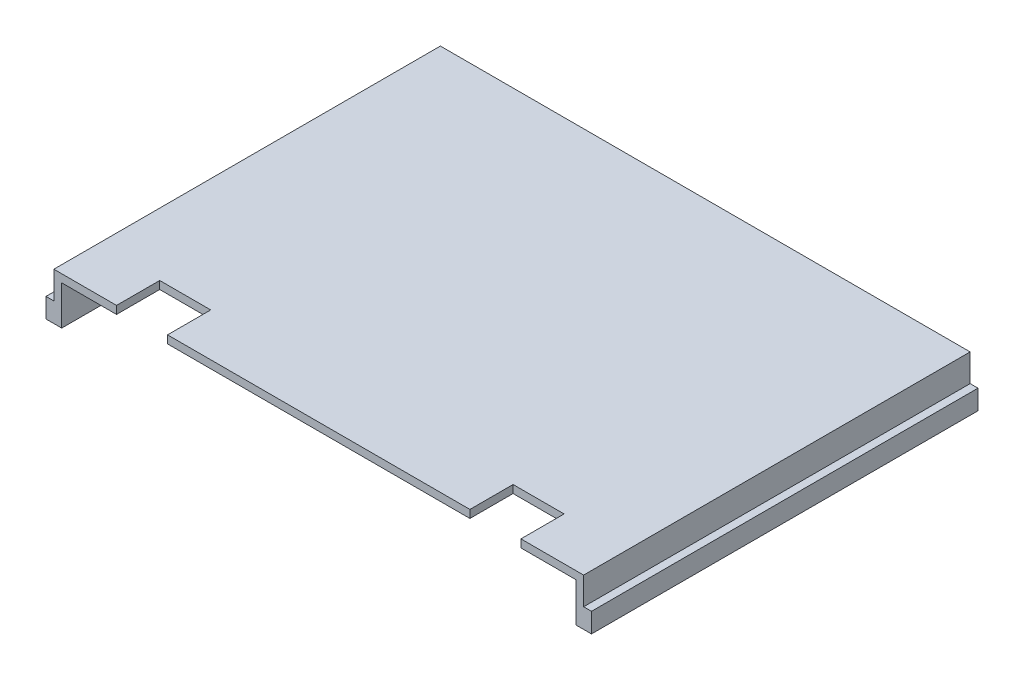
ISO-10303-21;
HEADER;
FILE_DESCRIPTION(('STEP AP214'),'2;1');
FILE_NAME('part.step','',(''),(''),'','','');
FILE_SCHEMA(('AUTOMOTIVE_DESIGN { 1 0 10303 214 1 1 1 1 }'));
ENDSEC;
DATA;
#1=APPLICATION_CONTEXT('core data for automotive mechanical design processes');
#2=APPLICATION_PROTOCOL_DEFINITION('international standard','automotive_design',2000,#1);
#3=PRODUCT_CONTEXT('',#1,'mechanical');
#4=PRODUCT('Part','Part','',(#3));
#5=PRODUCT_RELATED_PRODUCT_CATEGORY('part','',(#4));
#6=PRODUCT_DEFINITION_FORMATION('','',#4);
#7=PRODUCT_DEFINITION_CONTEXT('part definition',#1,'design');
#8=PRODUCT_DEFINITION('design','',#6,#7);
#9=PRODUCT_DEFINITION_SHAPE('','',#8);
#10=(LENGTH_UNIT() NAMED_UNIT(*) SI_UNIT(.MILLI.,.METRE.));
#11=(NAMED_UNIT(*) PLANE_ANGLE_UNIT() SI_UNIT($,.RADIAN.));
#12=(NAMED_UNIT(*) SI_UNIT($,.STERADIAN.) SOLID_ANGLE_UNIT());
#13=UNCERTAINTY_MEASURE_WITH_UNIT(LENGTH_MEASURE(1.E-05),#10,'distance_accuracy_value','');
#14=(GEOMETRIC_REPRESENTATION_CONTEXT(3) GLOBAL_UNCERTAINTY_ASSIGNED_CONTEXT((#13)) GLOBAL_UNIT_ASSIGNED_CONTEXT((#10,
#11,#12)) REPRESENTATION_CONTEXT('',''));
#15=CARTESIAN_POINT('',(0.,0.,0.));
#16=DIRECTION('',(0.,0.,1.));
#17=DIRECTION('',(1.,0.,0.));
#18=AXIS2_PLACEMENT_3D('',#15,#16,#17);
#19=CARTESIAN_POINT('',(0.,0.,197.));
#20=DIRECTION('',(0.,0.,1.));
#21=DIRECTION('',(1.,0.,0.));
#22=AXIS2_PLACEMENT_3D('',#19,#20,#21);
#23=PLANE('',#22);
#24=DIRECTION('',(0.,-1.,0.));
#25=VECTOR('',#24,1.);
#26=CARTESIAN_POINT('',(-18.6841463414634,0.,197.));
#27=LINE('',#26,#25);
#28=CARTESIAN_POINT('',(-18.6841463414634,10.0121951219512,197.));
#29=VERTEX_POINT('',#28);
#30=CARTESIAN_POINT('',(-18.6841463414634,6.01219512195124,197.));
#31=VERTEX_POINT('',#30);
#32=EDGE_CURVE('E186',#29,#31,#27,.T.);
#33=ORIENTED_EDGE('',*,*,#32,.F.);
#34=DIRECTION('',(-1.,0.,0.));
#35=VECTOR('',#34,1.);
#36=CARTESIAN_POINT('',(219.365853658537,10.0121951219513,197.));
#37=LINE('',#36,#35);
#38=CARTESIAN_POINT('',(-50.6341463414634,10.0121951219512,197.));
#39=VERTEX_POINT('',#38);
#40=EDGE_CURVE('E200',#29,#39,#37,.T.);
#41=ORIENTED_EDGE('',*,*,#40,.T.);
#42=DIRECTION('',(0.,-1.,0.));
#43=VECTOR('',#42,1.);
#44=CARTESIAN_POINT('',(-50.6341463414634,10.0121951219512,197.));
#45=LINE('',#44,#43);
#46=CARTESIAN_POINT('',(-50.6341463414634,-3.98780487804878,197.));
#47=VERTEX_POINT('',#46);
#48=EDGE_CURVE('E224',#39,#47,#45,.T.);
#49=ORIENTED_EDGE('',*,*,#48,.T.);
#50=DIRECTION('',(-1.,0.,0.));
#51=VECTOR('',#50,1.);
#52=CARTESIAN_POINT('',(-50.6341463414634,-3.98780487804878,197.));
#53=LINE('',#52,#51);
#54=CARTESIAN_POINT('',(-54.6341463414634,-3.98780487804878,197.));
#55=VERTEX_POINT('',#54);
#56=EDGE_CURVE('E229',#47,#55,#53,.T.);
#57=ORIENTED_EDGE('',*,*,#56,.T.);
#58=DIRECTION('',(0.,-1.,0.));
#59=VECTOR('',#58,1.);
#60=CARTESIAN_POINT('',(-54.6341463414634,-3.98780487804878,197.));
#61=LINE('',#60,#59);
#62=CARTESIAN_POINT('',(-54.6341463414634,-13.9878048780488,197.));
#63=VERTEX_POINT('',#62);
#64=EDGE_CURVE('E232',#55,#63,#61,.T.);
#65=ORIENTED_EDGE('',*,*,#64,.T.);
#66=DIRECTION('',(1.,0.,0.));
#67=VECTOR('',#66,1.);
#68=CARTESIAN_POINT('',(-54.6341463414634,-13.9878048780488,197.));
#69=LINE('',#68,#67);
#70=CARTESIAN_POINT('',(-46.6341463414634,-13.9878048780488,197.));
#71=VERTEX_POINT('',#70);
#72=EDGE_CURVE('E237',#63,#71,#69,.T.);
#73=ORIENTED_EDGE('',*,*,#72,.T.);
#74=DIRECTION('',(0.,1.,0.));
#75=VECTOR('',#74,1.);
#76=CARTESIAN_POINT('',(-46.6341463414634,-3.98780487804878,197.));
#77=LINE('',#76,#75);
#78=CARTESIAN_POINT('',(-46.6341463414634,6.01219512195122,197.));
#79=VERTEX_POINT('',#78);
#80=EDGE_CURVE('E240',#71,#79,#77,.T.);
#81=ORIENTED_EDGE('',*,*,#80,.T.);
#82=DIRECTION('',(1.,0.,0.));
#83=VECTOR('',#82,1.);
#84=CARTESIAN_POINT('',(-46.6341463414634,6.01219512195122,197.));
#85=LINE('',#84,#83);
#86=EDGE_CURVE('E203',#79,#31,#85,.T.);
#87=ORIENTED_EDGE('',*,*,#86,.T.);
#88=EDGE_LOOP('',(#33,#41,#49,#57,#65,#73,#81,#87));
#89=FACE_BOUND('',#88,.T.);
#90=ADVANCED_FACE('F45',(#89),#23,.T.);
#91=DIRECTION('',(0.,1.,0.));
#92=VECTOR('',#91,1.);
#93=CARTESIAN_POINT('',(187.415853658537,0.,197.));
#94=LINE('',#93,#92);
#95=CARTESIAN_POINT('',(187.415853658537,6.01219512195124,197.));
#96=VERTEX_POINT('',#95);
#97=CARTESIAN_POINT('',(187.415853658537,10.0121951219513,197.));
#98=VERTEX_POINT('',#97);
#99=EDGE_CURVE('E340',#96,#98,#94,.T.);
#100=ORIENTED_EDGE('',*,*,#99,.F.);
#101=CARTESIAN_POINT('',(215.365853658537,6.01219512195126,197.));
#102=VERTEX_POINT('',#101);
#103=EDGE_CURVE('E243',#96,#102,#85,.T.);
#104=ORIENTED_EDGE('',*,*,#103,.T.);
#105=DIRECTION('',(0.,-1.,0.));
#106=VECTOR('',#105,1.);
#107=CARTESIAN_POINT('',(215.365853658537,-3.98780487804874,197.));
#108=LINE('',#107,#106);
#109=CARTESIAN_POINT('',(215.365853658537,-13.9878048780487,197.));
#110=VERTEX_POINT('',#109);
#111=EDGE_CURVE('E246',#102,#110,#108,.T.);
#112=ORIENTED_EDGE('',*,*,#111,.T.);
#113=DIRECTION('',(1.,0.,0.));
#114=VECTOR('',#113,1.);
#115=CARTESIAN_POINT('',(223.365853658537,-13.9878048780487,197.));
#116=LINE('',#115,#114);
#117=CARTESIAN_POINT('',(223.365853658537,-13.9878048780487,197.));
#118=VERTEX_POINT('',#117);
#119=EDGE_CURVE('E291',#110,#118,#116,.T.);
#120=ORIENTED_EDGE('',*,*,#119,.T.);
#121=DIRECTION('',(0.,1.,0.));
#122=VECTOR('',#121,1.);
#123=CARTESIAN_POINT('',(223.365853658537,-3.98780487804874,197.));
#124=LINE('',#123,#122);
#125=CARTESIAN_POINT('',(223.365853658537,-3.98780487804874,197.));
#126=VERTEX_POINT('',#125);
#127=EDGE_CURVE('E391',#118,#126,#124,.T.);
#128=ORIENTED_EDGE('',*,*,#127,.T.);
#129=DIRECTION('',(-1.,0.,0.));
#130=VECTOR('',#129,1.);
#131=CARTESIAN_POINT('',(219.365853658537,-3.98780487804874,197.));
#132=LINE('',#131,#130);
#133=CARTESIAN_POINT('',(219.365853658537,-3.98780487804874,197.));
#134=VERTEX_POINT('',#133);
#135=EDGE_CURVE('E219',#126,#134,#132,.T.);
#136=ORIENTED_EDGE('',*,*,#135,.T.);
#137=DIRECTION('',(0.,1.,0.));
#138=VECTOR('',#137,1.);
#139=CARTESIAN_POINT('',(219.365853658537,10.0121951219513,197.));
#140=LINE('',#139,#138);
#141=CARTESIAN_POINT('',(219.365853658537,10.0121951219513,197.));
#142=VERTEX_POINT('',#141);
#143=EDGE_CURVE('E213',#134,#142,#140,.T.);
#144=ORIENTED_EDGE('',*,*,#143,.T.);
#145=EDGE_CURVE('E215',#142,#98,#37,.T.);
#146=ORIENTED_EDGE('',*,*,#145,.T.);
#147=EDGE_LOOP('',(#100,#104,#112,#120,#128,#136,#144,#146));
#148=FACE_BOUND('',#147,.T.);
#149=ADVANCED_FACE('F397',(#148),#23,.T.);
#150=CARTESIAN_POINT('',(223.365853658537,-3.98780487804874,197.));
#151=DIRECTION('',(-1.,0.,0.));
#152=DIRECTION('',(0.,0.,1.));
#153=AXIS2_PLACEMENT_3D('',#150,#151,#152);
#154=PLANE('',#153);
#155=DIRECTION('',(0.,1.,0.));
#156=VECTOR('',#155,1.);
#157=CARTESIAN_POINT('',(223.365853658537,-3.98780487804874,0.));
#158=LINE('',#157,#156);
#159=CARTESIAN_POINT('',(223.365853658537,-13.9878048780487,0.));
#160=VERTEX_POINT('',#159);
#161=CARTESIAN_POINT('',(223.365853658537,-3.98780487804874,0.));
#162=VERTEX_POINT('',#161);
#163=EDGE_CURVE('E251',#160,#162,#158,.T.);
#164=ORIENTED_EDGE('',*,*,#163,.T.);
#165=DIRECTION('',(0.,0.,-1.));
#166=VECTOR('',#165,1.);
#167=CARTESIAN_POINT('',(223.365853658537,-3.98780487804874,197.));
#168=LINE('',#167,#166);
#169=EDGE_CURVE('E329',#126,#162,#168,.T.);
#170=ORIENTED_EDGE('',*,*,#169,.F.);
#171=ORIENTED_EDGE('',*,*,#127,.F.);
#172=DIRECTION('',(0.,0.,-1.));
#173=VECTOR('',#172,1.);
#174=CARTESIAN_POINT('',(223.365853658537,-13.9878048780487,197.));
#175=LINE('',#174,#173);
#176=EDGE_CURVE('E333',#118,#160,#175,.T.);
#177=ORIENTED_EDGE('',*,*,#176,.T.);
#178=EDGE_LOOP('',(#164,#170,#171,#177));
#179=FACE_BOUND('',#178,.T.);
#180=ADVANCED_FACE('F47',(#179),#154,.F.);
#181=CARTESIAN_POINT('',(219.365853658537,-3.98780487804874,197.));
#182=DIRECTION('',(0.,-1.,0.));
#183=DIRECTION('',(0.,0.,-1.));
#184=AXIS2_PLACEMENT_3D('',#181,#182,#183);
#185=PLANE('',#184);
#186=DIRECTION('',(-1.,0.,0.));
#187=VECTOR('',#186,1.);
#188=CARTESIAN_POINT('',(219.365853658537,-3.98780487804874,0.));
#189=LINE('',#188,#187);
#190=CARTESIAN_POINT('',(219.365853658537,-3.98780487804874,0.));
#191=VERTEX_POINT('',#190);
#192=EDGE_CURVE('E254',#162,#191,#189,.T.);
#193=ORIENTED_EDGE('',*,*,#192,.T.);
#194=DIRECTION('',(0.,0.,-1.));
#195=VECTOR('',#194,1.);
#196=CARTESIAN_POINT('',(219.365853658537,-3.98780487804874,197.));
#197=LINE('',#196,#195);
#198=EDGE_CURVE('E325',#134,#191,#197,.T.);
#199=ORIENTED_EDGE('',*,*,#198,.F.);
#200=ORIENTED_EDGE('',*,*,#135,.F.);
#201=ORIENTED_EDGE('',*,*,#169,.T.);
#202=EDGE_LOOP('',(#193,#199,#200,#201));
#203=FACE_BOUND('',#202,.T.);
#204=ADVANCED_FACE('F402',(#203),#185,.F.);
#205=CARTESIAN_POINT('',(219.365853658537,10.0121951219513,197.));
#206=DIRECTION('',(-1.,0.,0.));
#207=DIRECTION('',(0.,-1.,0.));
#208=AXIS2_PLACEMENT_3D('',#205,#206,#207);
#209=PLANE('',#208);
#210=DIRECTION('',(0.,1.,0.));
#211=VECTOR('',#210,1.);
#212=CARTESIAN_POINT('',(219.365853658537,10.0121951219513,0.));
#213=LINE('',#212,#211);
#214=CARTESIAN_POINT('',(219.365853658537,10.0121951219513,0.));
#215=VERTEX_POINT('',#214);
#216=EDGE_CURVE('E258',#191,#215,#213,.T.);
#217=ORIENTED_EDGE('',*,*,#216,.T.);
#218=DIRECTION('',(0.,0.,-1.));
#219=VECTOR('',#218,1.);
#220=CARTESIAN_POINT('',(219.365853658537,10.0121951219513,197.));
#221=LINE('',#220,#219);
#222=EDGE_CURVE('E321',#142,#215,#221,.T.);
#223=ORIENTED_EDGE('',*,*,#222,.F.);
#224=ORIENTED_EDGE('',*,*,#143,.F.);
#225=ORIENTED_EDGE('',*,*,#198,.T.);
#226=EDGE_LOOP('',(#217,#223,#224,#225));
#227=FACE_BOUND('',#226,.T.);
#228=ADVANCED_FACE('F406',(#227),#209,.F.);
#229=CARTESIAN_POINT('',(219.365853658537,10.0121951219513,197.));
#230=DIRECTION('',(0.,-1.,0.));
#231=DIRECTION('',(1.,0.,0.));
#232=AXIS2_PLACEMENT_3D('',#229,#230,#231);
#233=PLANE('',#232);
#234=ORIENTED_EDGE('',*,*,#40,.F.);
#235=DIRECTION('',(0.,0.,1.));
#236=VECTOR('',#235,1.);
#237=CARTESIAN_POINT('',(-18.6841463414634,10.0121951219512,197.));
#238=LINE('',#237,#236);
#239=CARTESIAN_POINT('',(-18.6841463414634,10.0121951219512,175.));
#240=VERTEX_POINT('',#239);
#241=EDGE_CURVE('E183',#240,#29,#238,.T.);
#242=ORIENTED_EDGE('',*,*,#241,.F.);
#243=DIRECTION('',(-1.,0.,0.));
#244=VECTOR('',#243,1.);
#245=CARTESIAN_POINT('',(-18.6841463414634,10.0121951219512,175.));
#246=LINE('',#245,#244);
#247=CARTESIAN_POINT('',(7.31585365853659,10.0121951219512,175.));
#248=VERTEX_POINT('',#247);
#249=EDGE_CURVE('E496',#248,#240,#246,.T.);
#250=ORIENTED_EDGE('',*,*,#249,.F.);
#251=DIRECTION('',(0.,0.,-1.));
#252=VECTOR('',#251,1.);
#253=CARTESIAN_POINT('',(7.3158536585366,10.0121951219512,197.));
#254=LINE('',#253,#252);
#255=CARTESIAN_POINT('',(7.3158536585366,10.0121951219512,197.));
#256=VERTEX_POINT('',#255);
#257=EDGE_CURVE('E195',#256,#248,#254,.T.);
#258=ORIENTED_EDGE('',*,*,#257,.F.);
#259=CARTESIAN_POINT('',(161.415853658537,10.0121951219513,197.));
#260=VERTEX_POINT('',#259);
#261=EDGE_CURVE('E212',#260,#256,#37,.T.);
#262=ORIENTED_EDGE('',*,*,#261,.F.);
#263=DIRECTION('',(0.,0.,1.));
#264=VECTOR('',#263,1.);
#265=CARTESIAN_POINT('',(161.415853658537,10.0121951219513,197.));
#266=LINE('',#265,#264);
#267=CARTESIAN_POINT('',(161.415853658537,10.0121951219513,175.));
#268=VERTEX_POINT('',#267);
#269=EDGE_CURVE('E69',#268,#260,#266,.T.);
#270=ORIENTED_EDGE('',*,*,#269,.F.);
#271=DIRECTION('',(-1.,0.,0.));
#272=VECTOR('',#271,1.);
#273=CARTESIAN_POINT('',(161.415853658537,10.0121951219513,175.));
#274=LINE('',#273,#272);
#275=CARTESIAN_POINT('',(187.415853658537,10.0121951219513,175.));
#276=VERTEX_POINT('',#275);
#277=EDGE_CURVE('E196',#276,#268,#274,.T.);
#278=ORIENTED_EDGE('',*,*,#277,.F.);
#279=DIRECTION('',(0.,0.,-1.));
#280=VECTOR('',#279,1.);
#281=CARTESIAN_POINT('',(187.415853658537,10.0121951219513,197.));
#282=LINE('',#281,#280);
#283=EDGE_CURVE('E366',#98,#276,#282,.T.);
#284=ORIENTED_EDGE('',*,*,#283,.F.);
#285=ORIENTED_EDGE('',*,*,#145,.F.);
#286=ORIENTED_EDGE('',*,*,#222,.T.);
#287=DIRECTION('',(-1.,0.,0.));
#288=VECTOR('',#287,1.);
#289=CARTESIAN_POINT('',(219.365853658537,10.0121951219513,0.));
#290=LINE('',#289,#288);
#291=CARTESIAN_POINT('',(-50.6341463414634,10.0121951219512,0.));
#292=VERTEX_POINT('',#291);
#293=EDGE_CURVE('E261',#215,#292,#290,.T.);
#294=ORIENTED_EDGE('',*,*,#293,.T.);
#295=DIRECTION('',(0.,0.,-1.));
#296=VECTOR('',#295,1.);
#297=CARTESIAN_POINT('',(-50.6341463414634,10.0121951219512,197.));
#298=LINE('',#297,#296);
#299=EDGE_CURVE('E209',#39,#292,#298,.T.);
#300=ORIENTED_EDGE('',*,*,#299,.F.);
#301=EDGE_LOOP('',(#234,#242,#250,#258,#262,#270,#278,#284,#285,#286,#294,#300));
#302=FACE_BOUND('',#301,.T.);
#303=ADVANCED_FACE('F207',(#302),#233,.F.);
#304=CARTESIAN_POINT('',(-50.6341463414634,10.0121951219512,197.));
#305=DIRECTION('',(1.,0.,0.));
#306=DIRECTION('',(0.,1.,0.));
#307=AXIS2_PLACEMENT_3D('',#304,#305,#306);
#308=PLANE('',#307);
#309=DIRECTION('',(0.,-1.,0.));
#310=VECTOR('',#309,1.);
#311=CARTESIAN_POINT('',(-50.6341463414634,10.0121951219512,0.));
#312=LINE('',#311,#310);
#313=CARTESIAN_POINT('',(-50.6341463414634,-3.98780487804878,0.));
#314=VERTEX_POINT('',#313);
#315=EDGE_CURVE('E264',#292,#314,#312,.T.);
#316=ORIENTED_EDGE('',*,*,#315,.T.);
#317=DIRECTION('',(0.,0.,-1.));
#318=VECTOR('',#317,1.);
#319=CARTESIAN_POINT('',(-50.6341463414634,-3.98780487804878,197.));
#320=LINE('',#319,#318);
#321=EDGE_CURVE('E315',#47,#314,#320,.T.);
#322=ORIENTED_EDGE('',*,*,#321,.F.);
#323=ORIENTED_EDGE('',*,*,#48,.F.);
#324=ORIENTED_EDGE('',*,*,#299,.T.);
#325=EDGE_LOOP('',(#316,#322,#323,#324));
#326=FACE_BOUND('',#325,.T.);
#327=ADVANCED_FACE('F466',(#326),#308,.F.);
#328=CARTESIAN_POINT('',(-50.6341463414634,-3.98780487804878,197.));
#329=DIRECTION('',(0.,-1.,0.));
#330=DIRECTION('',(1.,0.,0.));
#331=AXIS2_PLACEMENT_3D('',#328,#329,#330);
#332=PLANE('',#331);
#333=DIRECTION('',(-1.,0.,0.));
#334=VECTOR('',#333,1.);
#335=CARTESIAN_POINT('',(-50.6341463414634,-3.98780487804878,0.));
#336=LINE('',#335,#334);
#337=CARTESIAN_POINT('',(-54.6341463414634,-3.98780487804878,0.));
#338=VERTEX_POINT('',#337);
#339=EDGE_CURVE('E267',#314,#338,#336,.T.);
#340=ORIENTED_EDGE('',*,*,#339,.T.);
#341=DIRECTION('',(0.,0.,-1.));
#342=VECTOR('',#341,1.);
#343=CARTESIAN_POINT('',(-54.6341463414634,-3.98780487804878,197.));
#344=LINE('',#343,#342);
#345=EDGE_CURVE('E311',#55,#338,#344,.T.);
#346=ORIENTED_EDGE('',*,*,#345,.F.);
#347=ORIENTED_EDGE('',*,*,#56,.F.);
#348=ORIENTED_EDGE('',*,*,#321,.T.);
#349=EDGE_LOOP('',(#340,#346,#347,#348));
#350=FACE_BOUND('',#349,.T.);
#351=ADVANCED_FACE('F462',(#350),#332,.F.);
#352=CARTESIAN_POINT('',(-54.6341463414634,-3.98780487804878,197.));
#353=DIRECTION('',(1.,0.,0.));
#354=DIRECTION('',(0.,0.,-1.));
#355=AXIS2_PLACEMENT_3D('',#352,#353,#354);
#356=PLANE('',#355);
#357=DIRECTION('',(0.,-1.,0.));
#358=VECTOR('',#357,1.);
#359=CARTESIAN_POINT('',(-54.6341463414634,-3.98780487804878,0.));
#360=LINE('',#359,#358);
#361=CARTESIAN_POINT('',(-54.6341463414634,-13.9878048780488,0.));
#362=VERTEX_POINT('',#361);
#363=EDGE_CURVE('E270',#338,#362,#360,.T.);
#364=ORIENTED_EDGE('',*,*,#363,.T.);
#365=DIRECTION('',(0.,0.,-1.));
#366=VECTOR('',#365,1.);
#367=CARTESIAN_POINT('',(-54.6341463414634,-13.9878048780488,197.));
#368=LINE('',#367,#366);
#369=EDGE_CURVE('E307',#63,#362,#368,.T.);
#370=ORIENTED_EDGE('',*,*,#369,.F.);
#371=ORIENTED_EDGE('',*,*,#64,.F.);
#372=ORIENTED_EDGE('',*,*,#345,.T.);
#373=EDGE_LOOP('',(#364,#370,#371,#372));
#374=FACE_BOUND('',#373,.T.);
#375=ADVANCED_FACE('F458',(#374),#356,.F.);
#376=CARTESIAN_POINT('',(-46.6341463414634,-13.9878048780488,197.));
#377=DIRECTION('',(0.,1.,0.));
#378=DIRECTION('',(-1.,0.,0.));
#379=AXIS2_PLACEMENT_3D('',#376,#377,#378);
#380=PLANE('',#379);
#381=DIRECTION('',(1.,0.,0.));
#382=VECTOR('',#381,1.);
#383=CARTESIAN_POINT('',(-46.6341463414634,-13.9878048780488,0.));
#384=LINE('',#383,#382);
#385=CARTESIAN_POINT('',(-46.6341463414634,-13.9878048780488,0.));
#386=VERTEX_POINT('',#385);
#387=EDGE_CURVE('E274',#362,#386,#384,.T.);
#388=ORIENTED_EDGE('',*,*,#387,.T.);
#389=DIRECTION('',(0.,0.,-1.));
#390=VECTOR('',#389,1.);
#391=CARTESIAN_POINT('',(-46.6341463414634,-13.9878048780488,197.));
#392=LINE('',#391,#390);
#393=EDGE_CURVE('E303',#71,#386,#392,.T.);
#394=ORIENTED_EDGE('',*,*,#393,.F.);
#395=ORIENTED_EDGE('',*,*,#72,.F.);
#396=ORIENTED_EDGE('',*,*,#369,.T.);
#397=EDGE_LOOP('',(#388,#394,#395,#396));
#398=FACE_BOUND('',#397,.T.);
#399=ADVANCED_FACE('F454',(#398),#380,.F.);
#400=CARTESIAN_POINT('',(-46.6341463414634,-3.98780487804878,197.));
#401=DIRECTION('',(-1.,0.,0.));
#402=DIRECTION('',(0.,0.,1.));
#403=AXIS2_PLACEMENT_3D('',#400,#401,#402);
#404=PLANE('',#403);
#405=DIRECTION('',(0.,1.,0.));
#406=VECTOR('',#405,1.);
#407=CARTESIAN_POINT('',(-46.6341463414634,-3.98780487804878,0.));
#408=LINE('',#407,#406);
#409=CARTESIAN_POINT('',(-46.6341463414634,6.01219512195122,0.));
#410=VERTEX_POINT('',#409);
#411=EDGE_CURVE('E278',#386,#410,#408,.T.);
#412=ORIENTED_EDGE('',*,*,#411,.T.);
#413=DIRECTION('',(0.,0.,-1.));
#414=VECTOR('',#413,1.);
#415=CARTESIAN_POINT('',(-46.6341463414634,6.01219512195122,197.));
#416=LINE('',#415,#414);
#417=EDGE_CURVE('E299',#79,#410,#416,.T.);
#418=ORIENTED_EDGE('',*,*,#417,.F.);
#419=ORIENTED_EDGE('',*,*,#80,.F.);
#420=ORIENTED_EDGE('',*,*,#393,.T.);
#421=EDGE_LOOP('',(#412,#418,#419,#420));
#422=FACE_BOUND('',#421,.T.);
#423=ADVANCED_FACE('F451',(#422),#404,.F.);
#424=CARTESIAN_POINT('',(-46.6341463414634,6.01219512195122,197.));
#425=DIRECTION('',(0.,1.,0.));
#426=DIRECTION('',(-1.,0.,0.));
#427=AXIS2_PLACEMENT_3D('',#424,#425,#426);
#428=PLANE('',#427);
#429=DIRECTION('',(-1.,0.,0.));
#430=VECTOR('',#429,1.);
#431=CARTESIAN_POINT('',(-46.6341463414634,6.01219512195122,175.));
#432=LINE('',#431,#430);
#433=CARTESIAN_POINT('',(7.31585365853659,6.01219512195123,175.));
#434=VERTEX_POINT('',#433);
#435=CARTESIAN_POINT('',(-18.6841463414634,6.01219512195123,175.));
#436=VERTEX_POINT('',#435);
#437=EDGE_CURVE('E11',#434,#436,#432,.T.);
#438=ORIENTED_EDGE('',*,*,#437,.T.);
#439=DIRECTION('',(0.,0.,1.));
#440=VECTOR('',#439,1.);
#441=CARTESIAN_POINT('',(-18.6841463414634,6.01219512195122,197.));
#442=LINE('',#441,#440);
#443=EDGE_CURVE('E255',#436,#31,#442,.T.);
#444=ORIENTED_EDGE('',*,*,#443,.T.);
#445=ORIENTED_EDGE('',*,*,#86,.F.);
#446=ORIENTED_EDGE('',*,*,#417,.T.);
#447=DIRECTION('',(1.,0.,0.));
#448=VECTOR('',#447,1.);
#449=CARTESIAN_POINT('',(-46.6341463414634,6.01219512195122,0.));
#450=LINE('',#449,#448);
#451=CARTESIAN_POINT('',(215.365853658537,6.01219512195126,0.));
#452=VERTEX_POINT('',#451);
#453=EDGE_CURVE('E281',#410,#452,#450,.T.);
#454=ORIENTED_EDGE('',*,*,#453,.T.);
#455=DIRECTION('',(0.,0.,-1.));
#456=VECTOR('',#455,1.);
#457=CARTESIAN_POINT('',(215.365853658537,6.01219512195126,197.));
#458=LINE('',#457,#456);
#459=EDGE_CURVE('E295',#102,#452,#458,.T.);
#460=ORIENTED_EDGE('',*,*,#459,.F.);
#461=ORIENTED_EDGE('',*,*,#103,.F.);
#462=DIRECTION('',(0.,0.,-1.));
#463=VECTOR('',#462,1.);
#464=CARTESIAN_POINT('',(187.415853658537,6.01219512195125,197.));
#465=LINE('',#464,#463);
#466=CARTESIAN_POINT('',(187.415853658537,6.01219512195125,175.));
#467=VERTEX_POINT('',#466);
#468=EDGE_CURVE('E354',#96,#467,#465,.T.);
#469=ORIENTED_EDGE('',*,*,#468,.T.);
#470=DIRECTION('',(-1.,0.,0.));
#471=VECTOR('',#470,1.);
#472=CARTESIAN_POINT('',(-46.6341463414634,6.01219512195122,175.));
#473=LINE('',#472,#471);
#474=CARTESIAN_POINT('',(161.415853658537,6.01219512195125,175.));
#475=VERTEX_POINT('',#474);
#476=EDGE_CURVE('E54',#467,#475,#473,.T.);
#477=ORIENTED_EDGE('',*,*,#476,.T.);
#478=DIRECTION('',(0.,0.,1.));
#479=VECTOR('',#478,1.);
#480=CARTESIAN_POINT('',(161.415853658537,6.01219512195125,197.));
#481=LINE('',#480,#479);
#482=CARTESIAN_POINT('',(161.415853658537,6.01219512195124,197.));
#483=VERTEX_POINT('',#482);
#484=EDGE_CURVE('E351',#475,#483,#481,.T.);
#485=ORIENTED_EDGE('',*,*,#484,.T.);
#486=CARTESIAN_POINT('',(7.3158536585366,6.01219512195123,197.));
#487=VERTEX_POINT('',#486);
#488=EDGE_CURVE('E247',#487,#483,#85,.T.);
#489=ORIENTED_EDGE('',*,*,#488,.F.);
#490=DIRECTION('',(0.,0.,-1.));
#491=VECTOR('',#490,1.);
#492=CARTESIAN_POINT('',(7.3158536585366,6.01219512195123,197.));
#493=LINE('',#492,#491);
#494=EDGE_CURVE('E61',#487,#434,#493,.T.);
#495=ORIENTED_EDGE('',*,*,#494,.T.);
#496=EDGE_LOOP('',(#438,#444,#445,#446,#454,#460,#461,#469,#477,#485,#489,#495));
#497=FACE_BOUND('',#496,.T.);
#498=ADVANCED_FACE('F349',(#497),#428,.F.);
#499=CARTESIAN_POINT('',(215.365853658537,-3.98780487804874,197.));
#500=DIRECTION('',(1.,0.,0.));
#501=DIRECTION('',(0.,0.,-1.));
#502=AXIS2_PLACEMENT_3D('',#499,#500,#501);
#503=PLANE('',#502);
#504=DIRECTION('',(0.,-1.,0.));
#505=VECTOR('',#504,1.);
#506=CARTESIAN_POINT('',(215.365853658537,-3.98780487804874,0.));
#507=LINE('',#506,#505);
#508=CARTESIAN_POINT('',(215.365853658537,-13.9878048780487,0.));
#509=VERTEX_POINT('',#508);
#510=EDGE_CURVE('E285',#452,#509,#507,.T.);
#511=ORIENTED_EDGE('',*,*,#510,.T.);
#512=DIRECTION('',(0.,0.,-1.));
#513=VECTOR('',#512,1.);
#514=CARTESIAN_POINT('',(215.365853658537,-13.9878048780487,197.));
#515=LINE('',#514,#513);
#516=EDGE_CURVE('E250',#110,#509,#515,.T.);
#517=ORIENTED_EDGE('',*,*,#516,.F.);
#518=ORIENTED_EDGE('',*,*,#111,.F.);
#519=ORIENTED_EDGE('',*,*,#459,.T.);
#520=EDGE_LOOP('',(#511,#517,#518,#519));
#521=FACE_BOUND('',#520,.T.);
#522=ADVANCED_FACE('F441',(#521),#503,.F.);
#523=CARTESIAN_POINT('',(219.135770599959,-13.9878048780487,197.));
#524=DIRECTION('',(0.,1.,0.));
#525=DIRECTION('',(0.,0.,1.));
#526=AXIS2_PLACEMENT_3D('',#523,#524,#525);
#527=PLANE('',#526);
#528=DIRECTION('',(1.,0.,0.));
#529=VECTOR('',#528,1.);
#530=CARTESIAN_POINT('',(219.135770599959,-13.9878048780487,0.));
#531=LINE('',#530,#529);
#532=EDGE_CURVE('E288',#509,#160,#531,.T.);
#533=ORIENTED_EDGE('',*,*,#532,.T.);
#534=ORIENTED_EDGE('',*,*,#176,.F.);
#535=ORIENTED_EDGE('',*,*,#119,.F.);
#536=ORIENTED_EDGE('',*,*,#516,.T.);
#537=EDGE_LOOP('',(#533,#534,#535,#536));
#538=FACE_BOUND('',#537,.T.);
#539=ADVANCED_FACE('F434',(#538),#527,.F.);
#540=DIRECTION('',(0.,1.,0.));
#541=VECTOR('',#540,1.);
#542=CARTESIAN_POINT('',(7.3158536585366,0.,197.));
#543=LINE('',#542,#541);
#544=EDGE_CURVE('E205',#487,#256,#543,.T.);
#545=ORIENTED_EDGE('',*,*,#544,.F.);
#546=ORIENTED_EDGE('',*,*,#488,.T.);
#547=DIRECTION('',(0.,-1.,0.));
#548=VECTOR('',#547,1.);
#549=CARTESIAN_POINT('',(161.415853658537,0.,197.));
#550=LINE('',#549,#548);
#551=EDGE_CURVE('E337',#260,#483,#550,.T.);
#552=ORIENTED_EDGE('',*,*,#551,.F.);
#553=ORIENTED_EDGE('',*,*,#261,.T.);
#554=EDGE_LOOP('',(#545,#546,#552,#553));
#555=FACE_BOUND('',#554,.T.);
#556=ADVANCED_FACE('F412',(#555),#23,.T.);
#557=CARTESIAN_POINT('',(0.,0.,0.));
#558=DIRECTION('',(0.,0.,1.));
#559=DIRECTION('',(1.,0.,0.));
#560=AXIS2_PLACEMENT_3D('',#557,#558,#559);
#561=PLANE('',#560);
#562=ORIENTED_EDGE('',*,*,#163,.F.);
#563=ORIENTED_EDGE('',*,*,#532,.F.);
#564=ORIENTED_EDGE('',*,*,#510,.F.);
#565=ORIENTED_EDGE('',*,*,#453,.F.);
#566=ORIENTED_EDGE('',*,*,#411,.F.);
#567=ORIENTED_EDGE('',*,*,#387,.F.);
#568=ORIENTED_EDGE('',*,*,#363,.F.);
#569=ORIENTED_EDGE('',*,*,#339,.F.);
#570=ORIENTED_EDGE('',*,*,#315,.F.);
#571=ORIENTED_EDGE('',*,*,#293,.F.);
#572=ORIENTED_EDGE('',*,*,#216,.F.);
#573=ORIENTED_EDGE('',*,*,#192,.F.);
#574=EDGE_LOOP('',(#562,#563,#564,#565,#566,#567,#568,#569,#570,#571,#572,#573));
#575=FACE_BOUND('',#574,.T.);
#576=ADVANCED_FACE('F433',(#575),#561,.F.);
#577=CARTESIAN_POINT('',(161.415853658537,-13.9878048780488,175.));
#578=DIRECTION('',(0.,0.,-1.));
#579=DIRECTION('',(-1.,0.,0.));
#580=AXIS2_PLACEMENT_3D('',#577,#578,#579);
#581=PLANE('',#580);
#582=DIRECTION('',(0.,1.,0.));
#583=VECTOR('',#582,1.);
#584=CARTESIAN_POINT('',(187.415853658537,-13.9878048780488,175.));
#585=LINE('',#584,#583);
#586=EDGE_CURVE('E360',#467,#276,#585,.T.);
#587=ORIENTED_EDGE('',*,*,#586,.T.);
#588=ORIENTED_EDGE('',*,*,#277,.T.);
#589=DIRECTION('',(0.,1.,0.));
#590=VECTOR('',#589,1.);
#591=CARTESIAN_POINT('',(161.415853658537,-13.9878048780488,175.));
#592=LINE('',#591,#590);
#593=EDGE_CURVE('E362',#475,#268,#592,.T.);
#594=ORIENTED_EDGE('',*,*,#593,.F.);
#595=ORIENTED_EDGE('',*,*,#476,.F.);
#596=EDGE_LOOP('',(#587,#588,#594,#595));
#597=FACE_BOUND('',#596,.T.);
#598=ADVANCED_FACE('F358',(#597),#581,.F.);
#599=CARTESIAN_POINT('',(187.415853658537,-13.9878048780488,197.));
#600=DIRECTION('',(1.,0.,0.));
#601=DIRECTION('',(0.,1.,0.));
#602=AXIS2_PLACEMENT_3D('',#599,#600,#601);
#603=PLANE('',#602);
#604=ORIENTED_EDGE('',*,*,#99,.T.);
#605=ORIENTED_EDGE('',*,*,#283,.T.);
#606=ORIENTED_EDGE('',*,*,#586,.F.);
#607=ORIENTED_EDGE('',*,*,#468,.F.);
#608=EDGE_LOOP('',(#604,#605,#606,#607));
#609=FACE_BOUND('',#608,.T.);
#610=ADVANCED_FACE('F364',(#609),#603,.F.);
#611=CARTESIAN_POINT('',(161.415853658537,-13.9878048780488,197.));
#612=DIRECTION('',(-1.,0.,0.));
#613=DIRECTION('',(0.,-1.,0.));
#614=AXIS2_PLACEMENT_3D('',#611,#612,#613);
#615=PLANE('',#614);
#616=ORIENTED_EDGE('',*,*,#593,.T.);
#617=ORIENTED_EDGE('',*,*,#269,.T.);
#618=ORIENTED_EDGE('',*,*,#551,.T.);
#619=ORIENTED_EDGE('',*,*,#484,.F.);
#620=EDGE_LOOP('',(#616,#617,#618,#619));
#621=FACE_BOUND('',#620,.T.);
#622=ADVANCED_FACE('F413',(#621),#615,.F.);
#623=CARTESIAN_POINT('',(-18.6841463414634,-13.9878048780488,175.));
#624=DIRECTION('',(0.,0.,-1.));
#625=DIRECTION('',(-1.,0.,0.));
#626=AXIS2_PLACEMENT_3D('',#623,#624,#625);
#627=PLANE('',#626);
#628=DIRECTION('',(0.,1.,0.));
#629=VECTOR('',#628,1.);
#630=CARTESIAN_POINT('',(7.3158536585366,-13.9878048780488,175.));
#631=LINE('',#630,#629);
#632=EDGE_CURVE('E498',#434,#248,#631,.T.);
#633=ORIENTED_EDGE('',*,*,#632,.T.);
#634=ORIENTED_EDGE('',*,*,#249,.T.);
#635=DIRECTION('',(0.,1.,0.));
#636=VECTOR('',#635,1.);
#637=CARTESIAN_POINT('',(-18.6841463414634,-13.9878048780488,175.));
#638=LINE('',#637,#636);
#639=EDGE_CURVE('E189',#436,#240,#638,.T.);
#640=ORIENTED_EDGE('',*,*,#639,.F.);
#641=ORIENTED_EDGE('',*,*,#437,.F.);
#642=EDGE_LOOP('',(#633,#634,#640,#641));
#643=FACE_BOUND('',#642,.T.);
#644=ADVANCED_FACE('F415',(#643),#627,.F.);
#645=CARTESIAN_POINT('',(-18.6841463414634,-13.9878048780488,197.));
#646=DIRECTION('',(-1.,0.,0.));
#647=DIRECTION('',(0.,-1.,0.));
#648=AXIS2_PLACEMENT_3D('',#645,#646,#647);
#649=PLANE('',#648);
#650=ORIENTED_EDGE('',*,*,#639,.T.);
#651=ORIENTED_EDGE('',*,*,#241,.T.);
#652=ORIENTED_EDGE('',*,*,#32,.T.);
#653=ORIENTED_EDGE('',*,*,#443,.F.);
#654=EDGE_LOOP('',(#650,#651,#652,#653));
#655=FACE_BOUND('',#654,.T.);
#656=ADVANCED_FACE('F185',(#655),#649,.F.);
#657=CARTESIAN_POINT('',(7.3158536585366,-13.9878048780488,197.));
#658=DIRECTION('',(1.,0.,0.));
#659=DIRECTION('',(0.,0.,-1.));
#660=AXIS2_PLACEMENT_3D('',#657,#658,#659);
#661=PLANE('',#660);
#662=ORIENTED_EDGE('',*,*,#544,.T.);
#663=ORIENTED_EDGE('',*,*,#257,.T.);
#664=ORIENTED_EDGE('',*,*,#632,.F.);
#665=ORIENTED_EDGE('',*,*,#494,.F.);
#666=EDGE_LOOP('',(#662,#663,#664,#665));
#667=FACE_BOUND('',#666,.T.);
#668=ADVANCED_FACE('F505',(#667),#661,.F.);
#669=CLOSED_SHELL('',(#90,#149,#180,#204,#228,#303,#327,#351,#375,#399,#423,#498,#522,#539,#556,
#576,#598,#610,#622,#644,#656,#668));
#670=MANIFOLD_SOLID_BREP('B2',#669);
#671=ADVANCED_BREP_SHAPE_REPRESENTATION('',(#18,#670),#14);
#672=SHAPE_DEFINITION_REPRESENTATION(#9,#671);
ENDSEC;
END-ISO-10303-21;
